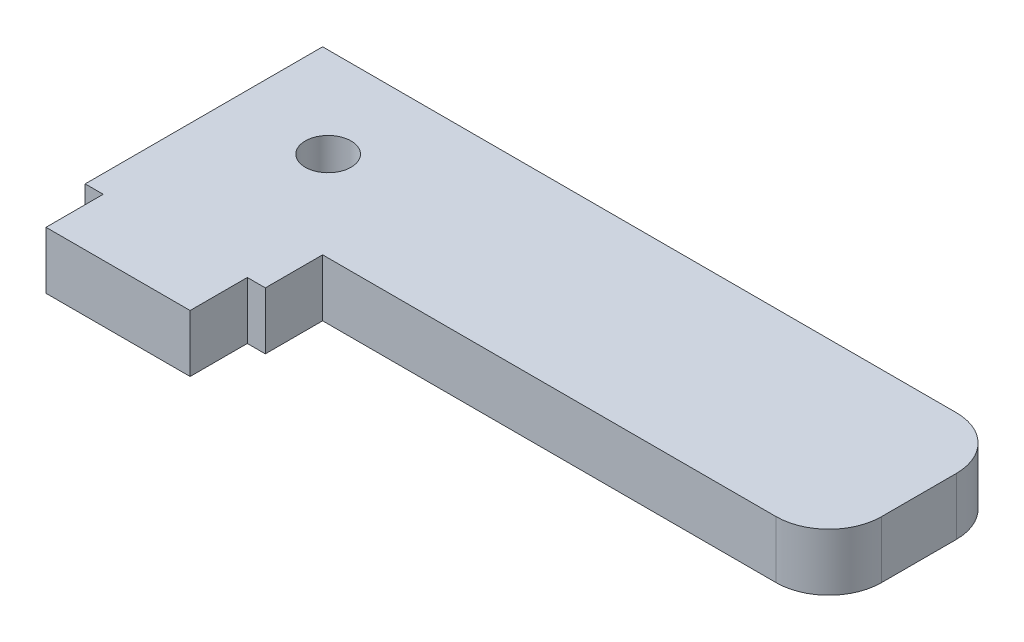
ISO-10303-21;
HEADER;
FILE_DESCRIPTION(('STEP AP214'),'2;1');
FILE_NAME('part.step','',(''),(''),'','','');
FILE_SCHEMA(('AUTOMOTIVE_DESIGN { 1 0 10303 214 1 1 1 1 }'));
ENDSEC;
DATA;
#1=APPLICATION_CONTEXT('core data for automotive mechanical design processes');
#2=APPLICATION_PROTOCOL_DEFINITION('international standard','automotive_design',2000,#1);
#3=PRODUCT_CONTEXT('',#1,'mechanical');
#4=PRODUCT('Part','Part','',(#3));
#5=PRODUCT_RELATED_PRODUCT_CATEGORY('part','',(#4));
#6=PRODUCT_DEFINITION_FORMATION('','',#4);
#7=PRODUCT_DEFINITION_CONTEXT('part definition',#1,'design');
#8=PRODUCT_DEFINITION('design','',#6,#7);
#9=PRODUCT_DEFINITION_SHAPE('','',#8);
#10=(LENGTH_UNIT() NAMED_UNIT(*) SI_UNIT(.MILLI.,.METRE.));
#11=(NAMED_UNIT(*) PLANE_ANGLE_UNIT() SI_UNIT($,.RADIAN.));
#12=(NAMED_UNIT(*) SI_UNIT($,.STERADIAN.) SOLID_ANGLE_UNIT());
#13=UNCERTAINTY_MEASURE_WITH_UNIT(LENGTH_MEASURE(1.E-05),#10,'distance_accuracy_value','');
#14=(GEOMETRIC_REPRESENTATION_CONTEXT(3) GLOBAL_UNCERTAINTY_ASSIGNED_CONTEXT((#13)) GLOBAL_UNIT_ASSIGNED_CONTEXT((#10,
#11,#12)) REPRESENTATION_CONTEXT('',''));
#15=CARTESIAN_POINT('',(0.,0.,0.));
#16=DIRECTION('',(0.,0.,1.));
#17=DIRECTION('',(1.,0.,0.));
#18=AXIS2_PLACEMENT_3D('',#15,#16,#17);
#19=CARTESIAN_POINT('',(0.,3.175,0.));
#20=DIRECTION('',(0.,-1.,0.));
#21=DIRECTION('',(0.,0.,-1.));
#22=AXIS2_PLACEMENT_3D('',#19,#20,#21);
#23=PLANE('',#22);
#24=DIRECTION('',(1.,0.,0.));
#25=VECTOR('',#24,1.);
#26=CARTESIAN_POINT('',(10.,3.175,0.));
#27=LINE('',#26,#25);
#28=CARTESIAN_POINT('',(1.,3.175,0.));
#29=VERTEX_POINT('',#28);
#30=CARTESIAN_POINT('',(9.,3.175,0.));
#31=VERTEX_POINT('',#30);
#32=EDGE_CURVE('E177',#29,#31,#27,.T.);
#33=ORIENTED_EDGE('',*,*,#32,.T.);
#34=DIRECTION('',(0.,0.,1.));
#35=VECTOR('',#34,1.);
#36=CARTESIAN_POINT('',(9.,3.175,-3.175));
#37=LINE('',#36,#35);
#38=CARTESIAN_POINT('',(9.,3.175,-3.175));
#39=VERTEX_POINT('',#38);
#40=EDGE_CURVE('E147',#39,#31,#37,.T.);
#41=ORIENTED_EDGE('',*,*,#40,.F.);
#42=DIRECTION('',(-1.,0.,0.));
#43=VECTOR('',#42,1.);
#44=CARTESIAN_POINT('',(10.,3.175,-3.175));
#45=LINE('',#44,#43);
#46=CARTESIAN_POINT('',(10.,3.175,-3.175));
#47=VERTEX_POINT('',#46);
#48=EDGE_CURVE('E128',#47,#39,#45,.T.);
#49=ORIENTED_EDGE('',*,*,#48,.F.);
#50=DIRECTION('',(0.,0.,-1.));
#51=VECTOR('',#50,1.);
#52=CARTESIAN_POINT('',(10.,3.175,-6.355));
#53=LINE('',#52,#51);
#54=CARTESIAN_POINT('',(10.,3.175,-6.355));
#55=VERTEX_POINT('',#54);
#56=EDGE_CURVE('E180',#47,#55,#53,.T.);
#57=ORIENTED_EDGE('',*,*,#56,.T.);
#58=DIRECTION('',(1.,0.,0.));
#59=VECTOR('',#58,1.);
#60=CARTESIAN_POINT('',(38.1,3.175,-6.355));
#61=LINE('',#60,#59);
#62=CARTESIAN_POINT('',(35.179,3.175,-6.355));
#63=VERTEX_POINT('',#62);
#64=EDGE_CURVE('E183',#55,#63,#61,.T.);
#65=ORIENTED_EDGE('',*,*,#64,.T.);
#66=CARTESIAN_POINT('',(35.179,3.175,-9.276));
#67=DIRECTION('',(0.,-1.,0.));
#68=DIRECTION('',(0.,0.,-1.));
#69=AXIS2_PLACEMENT_3D('',#66,#67,#68);
#70=CIRCLE('',#69,2.921);
#71=CARTESIAN_POINT('',(38.1,3.175,-9.276));
#72=VERTEX_POINT('',#71);
#73=EDGE_CURVE('E45',#63,#72,#70,.F.);
#74=ORIENTED_EDGE('',*,*,#73,.T.);
#75=DIRECTION('',(0.,0.,-1.));
#76=VECTOR('',#75,1.);
#77=CARTESIAN_POINT('',(38.1,3.175,-16.355));
#78=LINE('',#77,#76);
#79=CARTESIAN_POINT('',(38.1,3.175,-13.434));
#80=VERTEX_POINT('',#79);
#81=EDGE_CURVE('E186',#72,#80,#78,.T.);
#82=ORIENTED_EDGE('',*,*,#81,.T.);
#83=CARTESIAN_POINT('',(35.179,3.175,-13.434));
#84=DIRECTION('',(0.,-1.,0.));
#85=DIRECTION('',(0.,0.,-1.));
#86=AXIS2_PLACEMENT_3D('',#83,#84,#85);
#87=CIRCLE('',#86,2.921);
#88=CARTESIAN_POINT('',(35.179,3.175,-16.355));
#89=VERTEX_POINT('',#88);
#90=EDGE_CURVE('E223',#80,#89,#87,.F.);
#91=ORIENTED_EDGE('',*,*,#90,.T.);
#92=DIRECTION('',(-1.,0.,0.));
#93=VECTOR('',#92,1.);
#94=CARTESIAN_POINT('',(0.,3.175,-16.355));
#95=LINE('',#94,#93);
#96=CARTESIAN_POINT('',(0.,3.175,-16.355));
#97=VERTEX_POINT('',#96);
#98=EDGE_CURVE('E189',#89,#97,#95,.T.);
#99=ORIENTED_EDGE('',*,*,#98,.T.);
#100=DIRECTION('',(0.,0.,1.));
#101=VECTOR('',#100,1.);
#102=CARTESIAN_POINT('',(0.,3.175,0.));
#103=LINE('',#102,#101);
#104=CARTESIAN_POINT('',(0.,3.175,-3.175));
#105=VERTEX_POINT('',#104);
#106=EDGE_CURVE('E191',#97,#105,#103,.T.);
#107=ORIENTED_EDGE('',*,*,#106,.T.);
#108=DIRECTION('',(-1.,0.,0.));
#109=VECTOR('',#108,1.);
#110=CARTESIAN_POINT('',(0.,3.175,-3.175));
#111=LINE('',#110,#109);
#112=CARTESIAN_POINT('',(1.,3.175,-3.175));
#113=VERTEX_POINT('',#112);
#114=EDGE_CURVE('E60',#113,#105,#111,.T.);
#115=ORIENTED_EDGE('',*,*,#114,.F.);
#116=DIRECTION('',(0.,0.,-1.));
#117=VECTOR('',#116,1.);
#118=CARTESIAN_POINT('',(1.,3.175,0.));
#119=LINE('',#118,#117);
#120=EDGE_CURVE('E151',#29,#113,#119,.T.);
#121=ORIENTED_EDGE('',*,*,#120,.F.);
#122=EDGE_LOOP('',(#33,#41,#49,#57,#65,#74,#82,#91,#99,#107,#115,#121));
#123=FACE_BOUND('',#122,.T.);
#124=CARTESIAN_POINT('',(5.31299999999964,3.175,-11.35));
#125=DIRECTION('',(0.,1.,0.));
#126=DIRECTION('',(0.,0.,1.));
#127=AXIS2_PLACEMENT_3D('',#124,#125,#126);
#128=CIRCLE('',#127,1.27);
#129=CARTESIAN_POINT('',(5.31299999999964,3.175,-10.08));
#130=VERTEX_POINT('',#129);
#131=EDGE_CURVE('E171',#130,#130,#128,.T.);
#132=ORIENTED_EDGE('',*,*,#131,.F.);
#133=EDGE_LOOP('',(#132));
#134=FACE_BOUND('',#133,.T.);
#135=ADVANCED_FACE('F37',(#123,#134),#23,.F.);
#136=CARTESIAN_POINT('',(0.,0.,0.));
#137=DIRECTION('',(0.,-1.,0.));
#138=DIRECTION('',(0.,0.,-1.));
#139=AXIS2_PLACEMENT_3D('',#136,#137,#138);
#140=PLANE('',#139);
#141=DIRECTION('',(0.,0.,1.));
#142=VECTOR('',#141,1.);
#143=CARTESIAN_POINT('',(9.,0.,-3.175));
#144=LINE('',#143,#142);
#145=CARTESIAN_POINT('',(9.,0.,-3.175));
#146=VERTEX_POINT('',#145);
#147=CARTESIAN_POINT('',(9.,0.,0.));
#148=VERTEX_POINT('',#147);
#149=EDGE_CURVE('E135',#146,#148,#144,.T.);
#150=ORIENTED_EDGE('',*,*,#149,.T.);
#151=DIRECTION('',(1.,0.,0.));
#152=VECTOR('',#151,1.);
#153=CARTESIAN_POINT('',(10.,0.,0.));
#154=LINE('',#153,#152);
#155=CARTESIAN_POINT('',(1.,0.,0.));
#156=VERTEX_POINT('',#155);
#157=EDGE_CURVE('E174',#156,#148,#154,.T.);
#158=ORIENTED_EDGE('',*,*,#157,.F.);
#159=DIRECTION('',(0.,0.,-1.));
#160=VECTOR('',#159,1.);
#161=CARTESIAN_POINT('',(1.,0.,0.));
#162=LINE('',#161,#160);
#163=CARTESIAN_POINT('',(1.,0.,-3.175));
#164=VERTEX_POINT('',#163);
#165=EDGE_CURVE('E164',#156,#164,#162,.T.);
#166=ORIENTED_EDGE('',*,*,#165,.T.);
#167=DIRECTION('',(-1.,0.,0.));
#168=VECTOR('',#167,1.);
#169=CARTESIAN_POINT('',(0.,0.,-3.175));
#170=LINE('',#169,#168);
#171=CARTESIAN_POINT('',(0.,0.,-3.175));
#172=VERTEX_POINT('',#171);
#173=EDGE_CURVE('E158',#164,#172,#170,.T.);
#174=ORIENTED_EDGE('',*,*,#173,.T.);
#175=DIRECTION('',(0.,0.,1.));
#176=VECTOR('',#175,1.);
#177=CARTESIAN_POINT('',(0.,0.,0.));
#178=LINE('',#177,#176);
#179=CARTESIAN_POINT('',(0.,0.,-16.355));
#180=VERTEX_POINT('',#179);
#181=EDGE_CURVE('E181',#180,#172,#178,.T.);
#182=ORIENTED_EDGE('',*,*,#181,.F.);
#183=DIRECTION('',(-1.,0.,0.));
#184=VECTOR('',#183,1.);
#185=CARTESIAN_POINT('',(0.,0.,-16.355));
#186=LINE('',#185,#184);
#187=CARTESIAN_POINT('',(35.179,0.,-16.355));
#188=VERTEX_POINT('',#187);
#189=EDGE_CURVE('E203',#188,#180,#186,.T.);
#190=ORIENTED_EDGE('',*,*,#189,.F.);
#191=CARTESIAN_POINT('',(35.179,0.,-13.434));
#192=DIRECTION('',(0.,-1.,0.));
#193=DIRECTION('',(0.,0.,-1.));
#194=AXIS2_PLACEMENT_3D('',#191,#192,#193);
#195=CIRCLE('',#194,2.921);
#196=CARTESIAN_POINT('',(38.1,0.,-13.434));
#197=VERTEX_POINT('',#196);
#198=EDGE_CURVE('E217',#188,#197,#195,.T.);
#199=ORIENTED_EDGE('',*,*,#198,.T.);
#200=DIRECTION('',(0.,0.,-1.));
#201=VECTOR('',#200,1.);
#202=CARTESIAN_POINT('',(38.1,0.,-16.355));
#203=LINE('',#202,#201);
#204=CARTESIAN_POINT('',(38.1,0.,-9.276));
#205=VERTEX_POINT('',#204);
#206=EDGE_CURVE('E200',#205,#197,#203,.T.);
#207=ORIENTED_EDGE('',*,*,#206,.F.);
#208=CARTESIAN_POINT('',(35.179,0.,-9.276));
#209=DIRECTION('',(0.,-1.,0.));
#210=DIRECTION('',(0.,0.,-1.));
#211=AXIS2_PLACEMENT_3D('',#208,#209,#210);
#212=CIRCLE('',#211,2.921);
#213=CARTESIAN_POINT('',(35.179,0.,-6.355));
#214=VERTEX_POINT('',#213);
#215=EDGE_CURVE('E219',#205,#214,#212,.T.);
#216=ORIENTED_EDGE('',*,*,#215,.T.);
#217=DIRECTION('',(1.,0.,0.));
#218=VECTOR('',#217,1.);
#219=CARTESIAN_POINT('',(38.1,0.,-6.355));
#220=LINE('',#219,#218);
#221=CARTESIAN_POINT('',(10.,0.,-6.355));
#222=VERTEX_POINT('',#221);
#223=EDGE_CURVE('E197',#222,#214,#220,.T.);
#224=ORIENTED_EDGE('',*,*,#223,.F.);
#225=DIRECTION('',(0.,0.,-1.));
#226=VECTOR('',#225,1.);
#227=CARTESIAN_POINT('',(10.,0.,-6.355));
#228=LINE('',#227,#226);
#229=CARTESIAN_POINT('',(10.,0.,-3.175));
#230=VERTEX_POINT('',#229);
#231=EDGE_CURVE('E146',#230,#222,#228,.T.);
#232=ORIENTED_EDGE('',*,*,#231,.F.);
#233=DIRECTION('',(-1.,0.,0.));
#234=VECTOR('',#233,1.);
#235=CARTESIAN_POINT('',(10.,0.,-3.175));
#236=LINE('',#235,#234);
#237=EDGE_CURVE('E52',#230,#146,#236,.T.);
#238=ORIENTED_EDGE('',*,*,#237,.T.);
#239=EDGE_LOOP('',(#150,#158,#166,#174,#182,#190,#199,#207,#216,#224,#232,#238));
#240=FACE_BOUND('',#239,.T.);
#241=CARTESIAN_POINT('',(5.31299999999964,0.,-11.35));
#242=DIRECTION('',(0.,1.,0.));
#243=DIRECTION('',(0.,0.,1.));
#244=AXIS2_PLACEMENT_3D('',#241,#242,#243);
#245=CIRCLE('',#244,1.27);
#246=CARTESIAN_POINT('',(5.31299999999964,0.,-10.08));
#247=VERTEX_POINT('',#246);
#248=EDGE_CURVE('E153',#247,#247,#245,.T.);
#249=ORIENTED_EDGE('',*,*,#248,.T.);
#250=EDGE_LOOP('',(#249));
#251=FACE_BOUND('',#250,.T.);
#252=ADVANCED_FACE('F143',(#240,#251),#140,.T.);
#253=CARTESIAN_POINT('',(10.,3.175,0.));
#254=DIRECTION('',(0.,0.,-1.));
#255=DIRECTION('',(-1.,0.,0.));
#256=AXIS2_PLACEMENT_3D('',#253,#254,#255);
#257=PLANE('',#256);
#258=ORIENTED_EDGE('',*,*,#157,.T.);
#259=DIRECTION('',(0.,1.,0.));
#260=VECTOR('',#259,1.);
#261=CARTESIAN_POINT('',(9.,0.,0.));
#262=LINE('',#261,#260);
#263=EDGE_CURVE('E131',#148,#31,#262,.T.);
#264=ORIENTED_EDGE('',*,*,#263,.T.);
#265=ORIENTED_EDGE('',*,*,#32,.F.);
#266=DIRECTION('',(0.,1.,0.));
#267=VECTOR('',#266,1.);
#268=CARTESIAN_POINT('',(1.,0.,0.));
#269=LINE('',#268,#267);
#270=EDGE_CURVE('E156',#156,#29,#269,.T.);
#271=ORIENTED_EDGE('',*,*,#270,.F.);
#272=EDGE_LOOP('',(#258,#264,#265,#271));
#273=FACE_BOUND('',#272,.T.);
#274=ADVANCED_FACE('F247',(#273),#257,.F.);
#275=CARTESIAN_POINT('',(10.,3.175,-6.355));
#276=DIRECTION('',(-1.,0.,0.));
#277=DIRECTION('',(0.,0.,1.));
#278=AXIS2_PLACEMENT_3D('',#275,#276,#277);
#279=PLANE('',#278);
#280=ORIENTED_EDGE('',*,*,#56,.F.);
#281=DIRECTION('',(0.,1.,0.));
#282=VECTOR('',#281,1.);
#283=CARTESIAN_POINT('',(10.,0.,-3.175));
#284=LINE('',#283,#282);
#285=EDGE_CURVE('E132',#230,#47,#284,.T.);
#286=ORIENTED_EDGE('',*,*,#285,.F.);
#287=ORIENTED_EDGE('',*,*,#231,.T.);
#288=DIRECTION('',(0.,-1.,0.));
#289=VECTOR('',#288,1.);
#290=CARTESIAN_POINT('',(10.,3.175,-6.355));
#291=LINE('',#290,#289);
#292=EDGE_CURVE('E209',#55,#222,#291,.T.);
#293=ORIENTED_EDGE('',*,*,#292,.F.);
#294=EDGE_LOOP('',(#280,#286,#287,#293));
#295=FACE_BOUND('',#294,.T.);
#296=ADVANCED_FACE('F243',(#295),#279,.F.);
#297=CARTESIAN_POINT('',(38.1,3.175,-6.355));
#298=DIRECTION('',(0.,0.,-1.));
#299=DIRECTION('',(-1.,0.,0.));
#300=AXIS2_PLACEMENT_3D('',#297,#298,#299);
#301=PLANE('',#300);
#302=ORIENTED_EDGE('',*,*,#223,.T.);
#303=DIRECTION('',(0.,-1.,0.));
#304=VECTOR('',#303,1.);
#305=CARTESIAN_POINT('',(35.179,3.175,-6.355));
#306=LINE('',#305,#304);
#307=EDGE_CURVE('E221',#214,#63,#306,.F.);
#308=ORIENTED_EDGE('',*,*,#307,.T.);
#309=ORIENTED_EDGE('',*,*,#64,.F.);
#310=ORIENTED_EDGE('',*,*,#292,.T.);
#311=EDGE_LOOP('',(#302,#308,#309,#310));
#312=FACE_BOUND('',#311,.T.);
#313=ADVANCED_FACE('F239',(#312),#301,.F.);
#314=CARTESIAN_POINT('',(38.1,3.175,-16.355));
#315=DIRECTION('',(-1.,0.,0.));
#316=DIRECTION('',(0.,0.,1.));
#317=AXIS2_PLACEMENT_3D('',#314,#315,#316);
#318=PLANE('',#317);
#319=ORIENTED_EDGE('',*,*,#81,.F.);
#320=DIRECTION('',(0.,-1.,0.));
#321=VECTOR('',#320,1.);
#322=CARTESIAN_POINT('',(38.1,3.175,-9.276));
#323=LINE('',#322,#321);
#324=EDGE_CURVE('E214',#72,#205,#323,.T.);
#325=ORIENTED_EDGE('',*,*,#324,.T.);
#326=ORIENTED_EDGE('',*,*,#206,.T.);
#327=DIRECTION('',(0.,-1.,0.));
#328=VECTOR('',#327,1.);
#329=CARTESIAN_POINT('',(38.1,3.175,-13.434));
#330=LINE('',#329,#328);
#331=EDGE_CURVE('E212',#197,#80,#330,.F.);
#332=ORIENTED_EDGE('',*,*,#331,.T.);
#333=EDGE_LOOP('',(#319,#325,#326,#332));
#334=FACE_BOUND('',#333,.T.);
#335=ADVANCED_FACE('F234',(#334),#318,.F.);
#336=CARTESIAN_POINT('',(0.,3.175,-16.355));
#337=DIRECTION('',(0.,0.,1.));
#338=DIRECTION('',(1.,0.,0.));
#339=AXIS2_PLACEMENT_3D('',#336,#337,#338);
#340=PLANE('',#339);
#341=ORIENTED_EDGE('',*,*,#98,.F.);
#342=DIRECTION('',(0.,-1.,0.));
#343=VECTOR('',#342,1.);
#344=CARTESIAN_POINT('',(35.179,3.175,-16.355));
#345=LINE('',#344,#343);
#346=EDGE_CURVE('E11',#89,#188,#345,.T.);
#347=ORIENTED_EDGE('',*,*,#346,.T.);
#348=ORIENTED_EDGE('',*,*,#189,.T.);
#349=DIRECTION('',(0.,-1.,0.));
#350=VECTOR('',#349,1.);
#351=CARTESIAN_POINT('',(0.,3.175,-16.355));
#352=LINE('',#351,#350);
#353=EDGE_CURVE('E194',#97,#180,#352,.T.);
#354=ORIENTED_EDGE('',*,*,#353,.F.);
#355=EDGE_LOOP('',(#341,#347,#348,#354));
#356=FACE_BOUND('',#355,.T.);
#357=ADVANCED_FACE('F261',(#356),#340,.F.);
#358=CARTESIAN_POINT('',(0.,3.175,0.));
#359=DIRECTION('',(1.,0.,0.));
#360=DIRECTION('',(0.,0.,-1.));
#361=AXIS2_PLACEMENT_3D('',#358,#359,#360);
#362=PLANE('',#361);
#363=ORIENTED_EDGE('',*,*,#181,.T.);
#364=DIRECTION('',(0.,1.,0.));
#365=VECTOR('',#364,1.);
#366=CARTESIAN_POINT('',(0.,0.,-3.175));
#367=LINE('',#366,#365);
#368=EDGE_CURVE('E161',#172,#105,#367,.T.);
#369=ORIENTED_EDGE('',*,*,#368,.T.);
#370=ORIENTED_EDGE('',*,*,#106,.F.);
#371=ORIENTED_EDGE('',*,*,#353,.T.);
#372=EDGE_LOOP('',(#363,#369,#370,#371));
#373=FACE_BOUND('',#372,.T.);
#374=ADVANCED_FACE('F256',(#373),#362,.F.);
#375=CARTESIAN_POINT('',(5.31299999999964,3.175,-11.35));
#376=DIRECTION('',(0.,-1.,0.));
#377=DIRECTION('',(0.,0.,-1.));
#378=AXIS2_PLACEMENT_3D('',#375,#376,#377);
#379=CYLINDRICAL_SURFACE('',#378,1.27);
#380=ORIENTED_EDGE('',*,*,#131,.T.);
#381=EDGE_LOOP('',(#380));
#382=FACE_BOUND('',#381,.T.);
#383=ORIENTED_EDGE('',*,*,#248,.F.);
#384=EDGE_LOOP('',(#383));
#385=FACE_BOUND('',#384,.T.);
#386=ADVANCED_FACE('F270',(#382,#385),#379,.F.);
#387=CARTESIAN_POINT('',(35.179,3.175,-9.276));
#388=DIRECTION('',(0.,-1.,0.));
#389=DIRECTION('',(0.,0.,-1.));
#390=AXIS2_PLACEMENT_3D('',#387,#388,#389);
#391=CYLINDRICAL_SURFACE('',#390,2.921);
#392=ORIENTED_EDGE('',*,*,#73,.F.);
#393=ORIENTED_EDGE('',*,*,#307,.F.);
#394=ORIENTED_EDGE('',*,*,#215,.F.);
#395=ORIENTED_EDGE('',*,*,#324,.F.);
#396=EDGE_LOOP('',(#392,#393,#394,#395));
#397=FACE_BOUND('',#396,.T.);
#398=ADVANCED_FACE('F237',(#397),#391,.T.);
#399=CARTESIAN_POINT('',(35.179,3.175,-13.434));
#400=DIRECTION('',(0.,-1.,0.));
#401=DIRECTION('',(0.,0.,-1.));
#402=AXIS2_PLACEMENT_3D('',#399,#400,#401);
#403=CYLINDRICAL_SURFACE('',#402,2.921);
#404=ORIENTED_EDGE('',*,*,#90,.F.);
#405=ORIENTED_EDGE('',*,*,#331,.F.);
#406=ORIENTED_EDGE('',*,*,#198,.F.);
#407=ORIENTED_EDGE('',*,*,#346,.F.);
#408=EDGE_LOOP('',(#404,#405,#406,#407));
#409=FACE_BOUND('',#408,.T.);
#410=ADVANCED_FACE('F39',(#409),#403,.T.);
#411=CARTESIAN_POINT('',(0.,0.,-3.175));
#412=DIRECTION('',(0.,0.,-1.));
#413=DIRECTION('',(-1.,0.,0.));
#414=AXIS2_PLACEMENT_3D('',#411,#412,#413);
#415=PLANE('',#414);
#416=ORIENTED_EDGE('',*,*,#114,.T.);
#417=ORIENTED_EDGE('',*,*,#368,.F.);
#418=ORIENTED_EDGE('',*,*,#173,.F.);
#419=DIRECTION('',(0.,1.,0.));
#420=VECTOR('',#419,1.);
#421=CARTESIAN_POINT('',(1.,0.,-3.175));
#422=LINE('',#421,#420);
#423=EDGE_CURVE('E159',#164,#113,#422,.T.);
#424=ORIENTED_EDGE('',*,*,#423,.T.);
#425=EDGE_LOOP('',(#416,#417,#418,#424));
#426=FACE_BOUND('',#425,.T.);
#427=ADVANCED_FACE('F253',(#426),#415,.F.);
#428=CARTESIAN_POINT('',(1.,0.,0.));
#429=DIRECTION('',(1.,0.,0.));
#430=DIRECTION('',(0.,0.,-1.));
#431=AXIS2_PLACEMENT_3D('',#428,#429,#430);
#432=PLANE('',#431);
#433=ORIENTED_EDGE('',*,*,#120,.T.);
#434=ORIENTED_EDGE('',*,*,#423,.F.);
#435=ORIENTED_EDGE('',*,*,#165,.F.);
#436=ORIENTED_EDGE('',*,*,#270,.T.);
#437=EDGE_LOOP('',(#433,#434,#435,#436));
#438=FACE_BOUND('',#437,.T.);
#439=ADVANCED_FACE('F252',(#438),#432,.F.);
#440=CARTESIAN_POINT('',(9.,0.,-3.175));
#441=DIRECTION('',(-1.,0.,0.));
#442=DIRECTION('',(0.,0.,1.));
#443=AXIS2_PLACEMENT_3D('',#440,#441,#442);
#444=PLANE('',#443);
#445=ORIENTED_EDGE('',*,*,#40,.T.);
#446=ORIENTED_EDGE('',*,*,#263,.F.);
#447=ORIENTED_EDGE('',*,*,#149,.F.);
#448=DIRECTION('',(0.,1.,0.));
#449=VECTOR('',#448,1.);
#450=CARTESIAN_POINT('',(9.,0.,-3.175));
#451=LINE('',#450,#449);
#452=EDGE_CURVE('E124',#146,#39,#451,.T.);
#453=ORIENTED_EDGE('',*,*,#452,.T.);
#454=EDGE_LOOP('',(#445,#446,#447,#453));
#455=FACE_BOUND('',#454,.T.);
#456=ADVANCED_FACE('F136',(#455),#444,.F.);
#457=CARTESIAN_POINT('',(10.,0.,-3.175));
#458=DIRECTION('',(0.,0.,-1.));
#459=DIRECTION('',(-1.,0.,0.));
#460=AXIS2_PLACEMENT_3D('',#457,#458,#459);
#461=PLANE('',#460);
#462=ORIENTED_EDGE('',*,*,#48,.T.);
#463=ORIENTED_EDGE('',*,*,#452,.F.);
#464=ORIENTED_EDGE('',*,*,#237,.F.);
#465=ORIENTED_EDGE('',*,*,#285,.T.);
#466=EDGE_LOOP('',(#462,#463,#464,#465));
#467=FACE_BOUND('',#466,.T.);
#468=ADVANCED_FACE('F126',(#467),#461,.F.);
#469=CLOSED_SHELL('',(#135,#252,#274,#296,#313,#335,#357,#374,#386,#398,#410,#427,#439,#456,#468));
#470=MANIFOLD_SOLID_BREP('B2',#469);
#471=ADVANCED_BREP_SHAPE_REPRESENTATION('',(#18,#470),#14);
#472=SHAPE_DEFINITION_REPRESENTATION(#9,#471);
ENDSEC;
END-ISO-10303-21;
